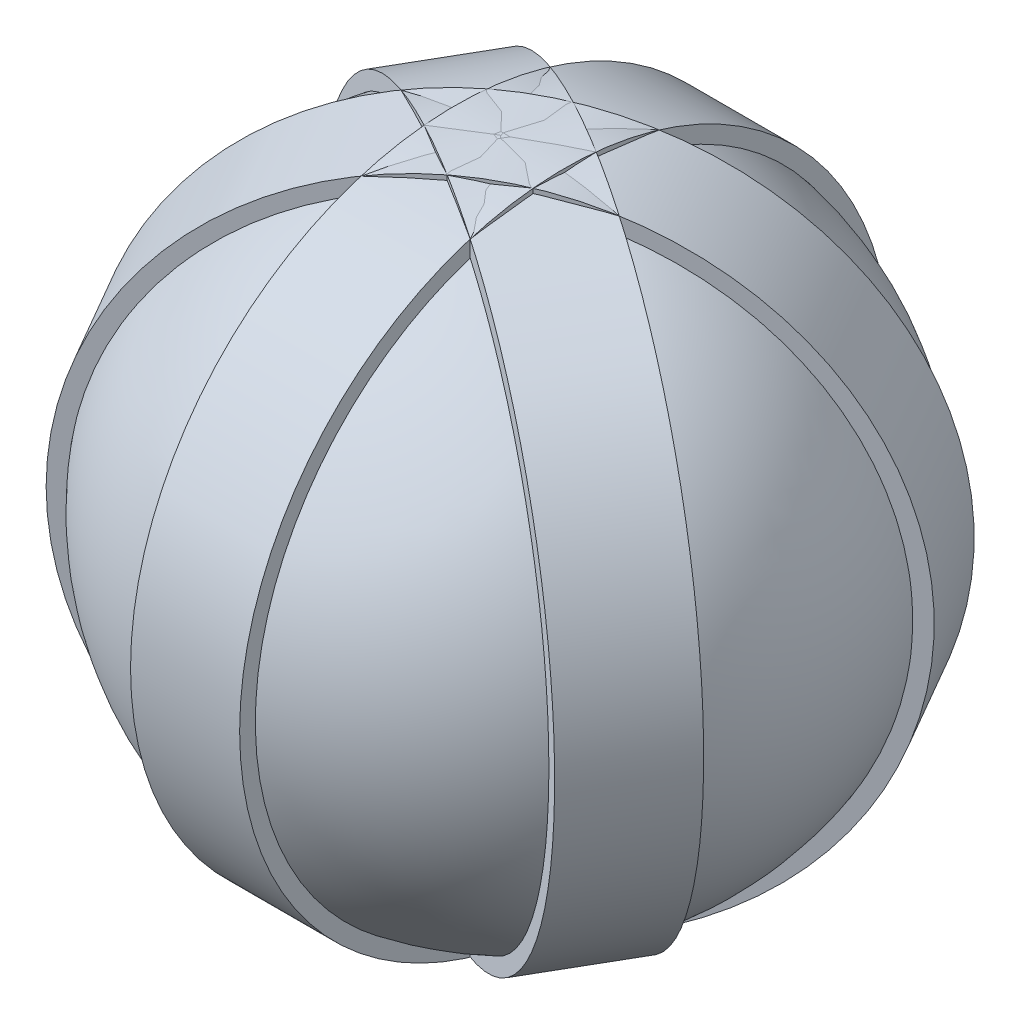
ISO-10303-21;
HEADER;
FILE_DESCRIPTION(('STEP AP214'),'2;1');
FILE_NAME('part.step','',(''),(''),'','','');
FILE_SCHEMA(('AUTOMOTIVE_DESIGN { 1 0 10303 214 1 1 1 1 }'));
ENDSEC;
DATA;
#1=APPLICATION_CONTEXT('core data for automotive mechanical design processes');
#2=APPLICATION_PROTOCOL_DEFINITION('international standard','automotive_design',2000,#1);
#3=PRODUCT_CONTEXT('',#1,'mechanical');
#4=PRODUCT('Part','Part','',(#3));
#5=PRODUCT_RELATED_PRODUCT_CATEGORY('part','',(#4));
#6=PRODUCT_DEFINITION_FORMATION('','',#4);
#7=PRODUCT_DEFINITION_CONTEXT('part definition',#1,'design');
#8=PRODUCT_DEFINITION('design','',#6,#7);
#9=PRODUCT_DEFINITION_SHAPE('','',#8);
#10=(LENGTH_UNIT() NAMED_UNIT(*) SI_UNIT(.MILLI.,.METRE.));
#11=(NAMED_UNIT(*) PLANE_ANGLE_UNIT() SI_UNIT($,.RADIAN.));
#12=(NAMED_UNIT(*) SI_UNIT($,.STERADIAN.) SOLID_ANGLE_UNIT());
#13=UNCERTAINTY_MEASURE_WITH_UNIT(LENGTH_MEASURE(1.E-05),#10,'distance_accuracy_value','');
#14=(GEOMETRIC_REPRESENTATION_CONTEXT(3) GLOBAL_UNCERTAINTY_ASSIGNED_CONTEXT((#13)) GLOBAL_UNIT_ASSIGNED_CONTEXT((#10,
#11,#12)) REPRESENTATION_CONTEXT('',''));
#15=CARTESIAN_POINT('',(0.,0.,0.));
#16=DIRECTION('',(0.,0.,1.));
#17=DIRECTION('',(1.,0.,0.));
#18=AXIS2_PLACEMENT_3D('',#15,#16,#17);
#19=CARTESIAN_POINT('',(20.0000000000001,0.,0.));
#20=DIRECTION('',(0.500000000000004,0.,-0.866025403784436));
#21=DIRECTION('',(0.,1.,0.));
#22=AXIS2_PLACEMENT_3D('',#19,#20,#21);
#23=SPHERICAL_SURFACE('',#22,20.);
#24=CARTESIAN_POINT('',(18.2635182233308,0.,3.00767466360865));
#25=DIRECTION('',(0.500000000000004,0.,-0.866025403784436));
#26=DIRECTION('',(-0.866025403784436,0.,-0.500000000000004));
#27=AXIS2_PLACEMENT_3D('',#24,#25,#26);
#28=CIRCLE('',#27,19.6961550602442);
#29=CARTESIAN_POINT('',(18.2635182233308,19.6961550602442,3.00767466360865));
#30=VERTEX_POINT('',#29);
#31=EDGE_CURVE('E54',#30,#30,#28,.T.);
#32=CARTESIAN_POINT('',(21.7364817766694,0.,-3.00767466360864));
#33=DIRECTION('',(0.500000000000004,0.,-0.866025403784436));
#34=DIRECTION('',(-0.866025403784436,0.,-0.500000000000004));
#35=AXIS2_PLACEMENT_3D('',#32,#33,#34);
#36=CIRCLE('',#35,19.6961550602442);
#37=CARTESIAN_POINT('',(21.7364817766693,19.6961550602442,-3.00767466360863));
#38=VERTEX_POINT('',#37);
#39=EDGE_CURVE('E11',#38,#38,#36,.T.);
#40=CARTESIAN_POINT('',(18.2635182233308,19.6961550602442,3.00767466360865));
#41=CARTESIAN_POINT('',(18.2993268423417,19.7087831288007,2.9456523161328));
#42=CARTESIAN_POINT('',(18.3351699017544,19.7210205530654,2.88357031613143));
#43=CARTESIAN_POINT('',(18.406920630354,19.7447127303297,2.75929440871671));
#44=CARTESIAN_POINT('',(18.4428282995411,19.7561674833292,2.69710050130335));
#45=CARTESIAN_POINT('',(18.5147039766607,19.7782929353812,2.57260817670371));
#46=CARTESIAN_POINT('',(18.5506719845933,19.7889636344337,2.51030975951741));
#47=CARTESIAN_POINT('',(18.6226640589355,19.8095197141586,2.38561582901454));
#48=CARTESIAN_POINT('',(18.658688125345,19.819405094831,2.32322031569796));
#49=CARTESIAN_POINT('',(18.7307880302541,19.8383893601214,2.19833961717458));
#50=CARTESIAN_POINT('',(18.7668638687536,19.8474882447393,2.13585443196779));
#51=CARTESIAN_POINT('',(18.8390630251473,19.8648984356229,2.01080182483028));
#52=CARTESIAN_POINT('',(18.8751863430415,19.8732097418886,1.94823440289958));
#53=CARTESIAN_POINT('',(18.9474761599194,19.8890437870041,1.82302476719727));
#54=CARTESIAN_POINT('',(18.983642658903,19.8965665258539,1.76038255342566));
#55=CARTESIAN_POINT('',(19.0560145345059,19.910822541034,1.63503078784244));
#56=CARTESIAN_POINT('',(19.0922199111251,19.9175558173643,1.57232123603082));
#57=CARTESIAN_POINT('',(19.1646652339219,19.9302321063056,1.44684225617607));
#58=CARTESIAN_POINT('',(19.2009051800995,19.9361751189165,1.38407282813295));
#59=CARTESIAN_POINT('',(19.2734153298216,19.9472701732621,1.2584815647497));
#60=CARTESIAN_POINT('',(19.3096855333662,19.9524222149967,1.19565972940957));
#61=CARTESIAN_POINT('',(19.382251882031,19.9619347145474,1.06997112660242));
#62=CARTESIAN_POINT('',(19.4185480271512,19.9662951723636,1.00710435913538));
#63=CARTESIAN_POINT('',(19.4911619400888,19.9742239852269,0.881333372591071));
#64=CARTESIAN_POINT('',(19.5274797079062,19.977792340274,0.818429153513792));
#65=CARTESIAN_POINT('',(19.6001325447872,19.9841365230004,0.692590748721993));
#66=CARTESIAN_POINT('',(19.6364676138507,19.9869123506797,0.629656563007473));
#67=CARTESIAN_POINT('',(19.7091507297139,19.9916711483749,0.503765713479931));
#68=CARTESIAN_POINT('',(19.7454987765137,19.9936541183908,0.440809049666908));
#69=CARTESIAN_POINT('',(19.8182035227953,19.9968269648055,0.314880735155771));
#70=CARTESIAN_POINT('',(19.8545602222771,19.9980168412044,0.251909084457657));
#71=CARTESIAN_POINT('',(19.9272779478394,19.9996033588016,0.125958289173031));
#72=CARTESIAN_POINT('',(19.9636389739197,20.,0.0629791445865202));
#73=CARTESIAN_POINT('',(20.0363610260804,20.,-0.0629791445865008));
#74=CARTESIAN_POINT('',(20.0727220521608,19.9996033588016,-0.125958289173011));
#75=CARTESIAN_POINT('',(20.145439777723,19.9980168412044,-0.251909084457636));
#76=CARTESIAN_POINT('',(20.1817964772049,19.9968269648055,-0.314880735155751));
#77=CARTESIAN_POINT('',(20.2545012234865,19.9936541183908,-0.440809049666888));
#78=CARTESIAN_POINT('',(20.2908492702862,19.9916711483749,-0.503765713479911));
#79=CARTESIAN_POINT('',(20.3635323861494,19.9869123506797,-0.629656563007453));
#80=CARTESIAN_POINT('',(20.3998674552129,19.9841365230004,-0.692590748721974));
#81=CARTESIAN_POINT('',(20.4725202920939,19.977792340274,-0.818429153513773));
#82=CARTESIAN_POINT('',(20.5088380599113,19.9742239852269,-0.881333372591052));
#83=CARTESIAN_POINT('',(20.5814519728489,19.9662951723636,-1.00710435913536));
#84=CARTESIAN_POINT('',(20.6177481179691,19.9619347145475,-1.0699711266024));
#85=CARTESIAN_POINT('',(20.6903144666339,19.9524222149967,-1.19565972940956));
#86=CARTESIAN_POINT('',(20.7265846701785,19.9472701732621,-1.25848156474968));
#87=CARTESIAN_POINT('',(20.7990948199007,19.9361751189166,-1.38407282813293));
#88=CARTESIAN_POINT('',(20.8353347660782,19.9302321063056,-1.44684225617605));
#89=CARTESIAN_POINT('',(20.907780088875,19.9175558173643,-1.5723212360308));
#90=CARTESIAN_POINT('',(20.9439854654942,19.910822541034,-1.63503078784242));
#91=CARTESIAN_POINT('',(21.0163573410971,19.8965665258539,-1.76038255342564));
#92=CARTESIAN_POINT('',(21.0525238400808,19.8890437870042,-1.82302476719725));
#93=CARTESIAN_POINT('',(21.1248136569586,19.8732097418887,-1.94823440289956));
#94=CARTESIAN_POINT('',(21.1609369748528,19.8648984356229,-2.01080182483026));
#95=CARTESIAN_POINT('',(21.2331361312465,19.8474882447393,-2.13585443196777));
#96=CARTESIAN_POINT('',(21.269211969746,19.8383893601214,-2.19833961717456));
#97=CARTESIAN_POINT('',(21.3413118746551,19.8194050948311,-2.32322031569794));
#98=CARTESIAN_POINT('',(21.3773359410647,19.8095197141586,-2.38561582901452));
#99=CARTESIAN_POINT('',(21.4493280154068,19.7889636344337,-2.5103097595174));
#100=CARTESIAN_POINT('',(21.4852960233394,19.7782929353812,-2.57260817670369));
#101=CARTESIAN_POINT('',(21.557171700459,19.7561674833292,-2.69710050130333));
#102=CARTESIAN_POINT('',(21.5930793696461,19.7447127303297,-2.75929440871669));
#103=CARTESIAN_POINT('',(21.6648300982458,19.7210205530655,-2.88357031613141));
#104=CARTESIAN_POINT('',(21.7006731576584,19.7087831288007,-2.94565231613278));
#105=CARTESIAN_POINT('',(21.7364817766693,19.6961550602442,-3.00767466360863));
#106=B_SPLINE_CURVE_WITH_KNOTS('',3,(#40,#41,#42,#43,#44,#45,#46,#47,#48,#49,#50,#51,#52,#53,
#54,#55,#56,#57,#58,#59,#60,#61,#62,#63,#64,#65,#66,#67,#68,#69,#70,#71,#72,#73,#74,#75,#76,#77,
#78,#79,#80,#81,#82,#83,#84,#85,#86,#87,#88,#89,#90,#91,#92,#93,#94,#95,#96,#97,#98,#99,#100,
#101,#102,#103,#104,#105),.UNSPECIFIED.,.F.,.F.,(4,2,2,2,2,2,2,2,2,2,2,2,2,2,2,2,2,2,2,2,2,2,2,
2,2,2,2,2,2,2,2,2,4),(0.,0.218165074840549,0.4363301496811,0.65449522452165,0.8726602993622,
1.09082537420275,1.3089904490433,1.52715552388385,1.7453205987244,1.96348567356495,
2.1816507484055,2.39981582324605,2.6179808980866,2.83614597292715,3.0543110477677,
3.27247612260825,3.4906411974488,3.70880627228935,3.9269713471299,4.14513642197045,
4.36330149681099,4.58146657165154,4.7996316464921,5.01779672133264,5.23596179617319,
5.45412687101375,5.67229194585429,5.89045702069484,6.1086220955354,6.32678717037594,
6.54495224521649,6.76311732005704,6.98128239489759),.UNSPECIFIED.);
#107=EDGE_CURVE('BSEAM40',#30,#38,#106,.T.);
#108=ORIENTED_EDGE('',*,*,#31,.F.);
#109=ORIENTED_EDGE('',*,*,#39,.T.);
#110=ORIENTED_EDGE('',*,*,#107,.T.);
#111=ORIENTED_EDGE('',*,*,#107,.F.);
#112=EDGE_LOOP('',(#108,#110,#109,#111));
#113=FACE_BOUND('',#112,.T.);
#114=ADVANCED_FACE('F40',(#113),#23,.F.);
#115=CARTESIAN_POINT('',(21.7364817766694,19.6961550602442,-3.00767466360864));
#116=DIRECTION('',(-0.500000000000004,0.,0.866025403784436));
#117=DIRECTION('',(0.866025403784436,0.,0.500000000000004));
#118=AXIS2_PLACEMENT_3D('',#115,#116,#117);
#119=PLANE('',#118);
#120=ORIENTED_EDGE('',*,*,#39,.F.);
#121=EDGE_LOOP('',(#120));
#122=FACE_BOUND('',#121,.T.);
#123=CARTESIAN_POINT('',(21.7364817766694,0.,-3.00767466360864));
#124=DIRECTION('',(0.500000000000004,0.,-0.866025403784436));
#125=DIRECTION('',(-0.866025403784436,0.,-0.500000000000004));
#126=AXIS2_PLACEMENT_3D('',#123,#124,#125);
#127=CIRCLE('',#126,20.6961550602442);
#128=CARTESIAN_POINT('',(3.81308573383607,0.,-13.3557521937308));
#129=VERTEX_POINT('',#128);
#130=EDGE_CURVE('E46',#129,#129,#127,.T.);
#131=ORIENTED_EDGE('',*,*,#130,.T.);
#132=EDGE_LOOP('',(#131));
#133=FACE_BOUND('',#132,.T.);
#134=ADVANCED_FACE('F63',(#122,#133),#119,.F.);
#135=CARTESIAN_POINT('',(30.0000000000002,0.,-17.3205080756888));
#136=DIRECTION('',(0.500000000000004,0.,-0.866025403784436));
#137=DIRECTION('',(-0.866025403784436,0.,-0.500000000000004));
#138=AXIS2_PLACEMENT_3D('',#135,#136,#137);
#139=CYLINDRICAL_SURFACE('',#138,20.6961550602442);
#140=ORIENTED_EDGE('',*,*,#130,.F.);
#141=EDGE_LOOP('',(#140));
#142=FACE_BOUND('',#141,.T.);
#143=CARTESIAN_POINT('',(18.2635182233308,0.,3.00767466360865));
#144=DIRECTION('',(0.500000000000004,0.,-0.866025403784436));
#145=DIRECTION('',(-0.866025403784436,0.,-0.500000000000004));
#146=AXIS2_PLACEMENT_3D('',#143,#144,#145);
#147=CIRCLE('',#146,20.6961550602442);
#148=CARTESIAN_POINT('',(0.340122180497497,0.,-7.34040286651353));
#149=VERTEX_POINT('',#148);
#150=EDGE_CURVE('E50',#149,#149,#147,.T.);
#151=ORIENTED_EDGE('',*,*,#150,.T.);
#152=EDGE_LOOP('',(#151));
#153=FACE_BOUND('',#152,.T.);
#154=ADVANCED_FACE('F67',(#142,#153),#139,.T.);
#155=CARTESIAN_POINT('',(18.2635182233308,20.6961550602442,3.00767466360865));
#156=DIRECTION('',(0.500000000000004,0.,-0.866025403784436));
#157=DIRECTION('',(-0.866025403784436,0.,-0.500000000000004));
#158=AXIS2_PLACEMENT_3D('',#155,#156,#157);
#159=PLANE('',#158);
#160=ORIENTED_EDGE('',*,*,#150,.F.);
#161=EDGE_LOOP('',(#160));
#162=FACE_BOUND('',#161,.T.);
#163=ORIENTED_EDGE('',*,*,#31,.T.);
#164=EDGE_LOOP('',(#163));
#165=FACE_BOUND('',#164,.T.);
#166=ADVANCED_FACE('F60',(#162,#165),#159,.F.);
#167=CLOSED_SHELL('',(#114,#134,#154,#166));
#168=MANIFOLD_SOLID_BREP('B2',#167);
#169=CARTESIAN_POINT('',(20.,0.,0.));
#170=DIRECTION('',(-0.499999999999998,0.,-0.86602540378444));
#171=DIRECTION('',(0.,1.,0.));
#172=AXIS2_PLACEMENT_3D('',#169,#170,#171);
#173=SPHERICAL_SURFACE('',#172,20.);
#174=CARTESIAN_POINT('',(21.7364817766693,0.,3.00767466360866));
#175=DIRECTION('',(-0.499999999999998,0.,-0.86602540378444));
#176=DIRECTION('',(-0.86602540378444,0.,0.499999999999998));
#177=AXIS2_PLACEMENT_3D('',#174,#175,#176);
#178=CIRCLE('',#177,19.6961550602442);
#179=CARTESIAN_POINT('',(21.7364817766693,19.6961550602442,3.00767466360867));
#180=VERTEX_POINT('',#179);
#181=EDGE_CURVE('E124',#180,#180,#178,.T.);
#182=CARTESIAN_POINT('',(18.2635182233308,0.,-3.00767466360865));
#183=DIRECTION('',(-0.499999999999998,0.,-0.86602540378444));
#184=DIRECTION('',(-0.86602540378444,0.,0.499999999999998));
#185=AXIS2_PLACEMENT_3D('',#182,#183,#184);
#186=CIRCLE('',#185,19.6961550602442);
#187=CARTESIAN_POINT('',(18.2635182233308,19.6961550602442,-3.00767466360864));
#188=VERTEX_POINT('',#187);
#189=EDGE_CURVE('E39',#188,#188,#186,.T.);
#190=CARTESIAN_POINT('',(21.7364817766693,19.6961550602442,3.00767466360867));
#191=CARTESIAN_POINT('',(21.7006731576584,19.7087831288007,2.94565231613282));
#192=CARTESIAN_POINT('',(21.6648300982458,19.7210205530654,2.88357031613145));
#193=CARTESIAN_POINT('',(21.5930793696461,19.7447127303297,2.75929440871672));
#194=CARTESIAN_POINT('',(21.557171700459,19.7561674833292,2.69710050130336));
#195=CARTESIAN_POINT('',(21.4852960233394,19.7782929353812,2.57260817670372));
#196=CARTESIAN_POINT('',(21.4493280154068,19.7889636344337,2.51030975951743));
#197=CARTESIAN_POINT('',(21.3773359410646,19.8095197141586,2.38561582901455));
#198=CARTESIAN_POINT('',(21.3413118746551,19.819405094831,2.32322031569797));
#199=CARTESIAN_POINT('',(21.269211969746,19.8383893601214,2.19833961717459));
#200=CARTESIAN_POINT('',(21.2331361312465,19.8474882447393,2.1358544319678));
#201=CARTESIAN_POINT('',(21.1609369748528,19.8648984356229,2.01080182483029));
#202=CARTESIAN_POINT('',(21.1248136569586,19.8732097418886,1.94823440289959));
#203=CARTESIAN_POINT('',(21.0525238400808,19.8890437870041,1.82302476719727));
#204=CARTESIAN_POINT('',(21.0163573410971,19.8965665258539,1.76038255342567));
#205=CARTESIAN_POINT('',(20.9439854654942,19.910822541034,1.63503078784244));
#206=CARTESIAN_POINT('',(20.907780088875,19.9175558173643,1.57232123603082));
#207=CARTESIAN_POINT('',(20.8353347660782,19.9302321063056,1.44684225617608));
#208=CARTESIAN_POINT('',(20.7990948199007,19.9361751189165,1.38407282813296));
#209=CARTESIAN_POINT('',(20.7265846701785,19.9472701732621,1.25848156474971));
#210=CARTESIAN_POINT('',(20.6903144666339,19.9524222149967,1.19565972940958));
#211=CARTESIAN_POINT('',(20.6177481179691,19.9619347145474,1.06997112660242));
#212=CARTESIAN_POINT('',(20.5814519728489,19.9662951723636,1.00710435913539));
#213=CARTESIAN_POINT('',(20.5088380599113,19.9742239852269,0.881333372591076));
#214=CARTESIAN_POINT('',(20.4725202920939,19.977792340274,0.818429153513797));
#215=CARTESIAN_POINT('',(20.3998674552129,19.9841365230004,0.692590748721998));
#216=CARTESIAN_POINT('',(20.3635323861494,19.9869123506797,0.629656563007477));
#217=CARTESIAN_POINT('',(20.2908492702862,19.9916711483749,0.503765713479934));
#218=CARTESIAN_POINT('',(20.2545012234865,19.9936541183908,0.440809049666911));
#219=CARTESIAN_POINT('',(20.1817964772049,19.9968269648055,0.314880735155774));
#220=CARTESIAN_POINT('',(20.145439777723,19.9980168412044,0.251909084457659));
#221=CARTESIAN_POINT('',(20.0727220521608,19.9996033588016,0.125958289173033));
#222=CARTESIAN_POINT('',(20.0363610260804,20.,0.0629791445865222));
#223=CARTESIAN_POINT('',(19.9636389739197,20.,-0.0629791445864993));
#224=CARTESIAN_POINT('',(19.9272779478394,19.9996033588016,-0.12595828917301));
#225=CARTESIAN_POINT('',(19.8545602222771,19.9980168412044,-0.251909084457636));
#226=CARTESIAN_POINT('',(19.8182035227953,19.9968269648055,-0.314880735155751));
#227=CARTESIAN_POINT('',(19.7454987765137,19.9936541183908,-0.440809049666889));
#228=CARTESIAN_POINT('',(19.7091507297139,19.9916711483749,-0.503765713479911));
#229=CARTESIAN_POINT('',(19.6364676138507,19.9869123506797,-0.629656563007454));
#230=CARTESIAN_POINT('',(19.6001325447872,19.9841365230004,-0.692590748721975));
#231=CARTESIAN_POINT('',(19.5274797079062,19.977792340274,-0.818429153513775));
#232=CARTESIAN_POINT('',(19.4911619400888,19.9742239852269,-0.881333372591054));
#233=CARTESIAN_POINT('',(19.4185480271512,19.9662951723636,-1.00710435913537));
#234=CARTESIAN_POINT('',(19.382251882031,19.9619347145475,-1.0699711266024));
#235=CARTESIAN_POINT('',(19.3096855333663,19.9524222149967,-1.19565972940956));
#236=CARTESIAN_POINT('',(19.2734153298217,19.9472701732621,-1.25848156474968));
#237=CARTESIAN_POINT('',(19.2009051800995,19.9361751189166,-1.38407282813293));
#238=CARTESIAN_POINT('',(19.1646652339219,19.9302321063056,-1.44684225617606));
#239=CARTESIAN_POINT('',(19.0922199111251,19.9175558173643,-1.5723212360308));
#240=CARTESIAN_POINT('',(19.0560145345059,19.910822541034,-1.63503078784242));
#241=CARTESIAN_POINT('',(18.983642658903,19.8965665258539,-1.76038255342565));
#242=CARTESIAN_POINT('',(18.9474761599194,19.8890437870042,-1.82302476719725));
#243=CARTESIAN_POINT('',(18.8751863430415,19.8732097418887,-1.94823440289956));
#244=CARTESIAN_POINT('',(18.8390630251473,19.8648984356229,-2.01080182483027));
#245=CARTESIAN_POINT('',(18.7668638687536,19.8474882447393,-2.13585443196777));
#246=CARTESIAN_POINT('',(18.7307880302541,19.8383893601214,-2.19833961717457));
#247=CARTESIAN_POINT('',(18.658688125345,19.8194050948311,-2.32322031569795));
#248=CARTESIAN_POINT('',(18.6226640589355,19.8095197141586,-2.38561582901453));
#249=CARTESIAN_POINT('',(18.5506719845934,19.7889636344337,-2.5103097595174));
#250=CARTESIAN_POINT('',(18.5147039766608,19.7782929353812,-2.5726081767037));
#251=CARTESIAN_POINT('',(18.4428282995411,19.7561674833292,-2.69710050130334));
#252=CARTESIAN_POINT('',(18.4069206303541,19.7447127303297,-2.7592944087167));
#253=CARTESIAN_POINT('',(18.3351699017544,19.7210205530655,-2.88357031613142));
#254=CARTESIAN_POINT('',(18.2993268423418,19.7087831288007,-2.94565231613279));
#255=CARTESIAN_POINT('',(18.2635182233308,19.6961550602442,-3.00767466360864));
#256=B_SPLINE_CURVE_WITH_KNOTS('',3,(#190,#191,#192,#193,#194,#195,#196,#197,#198,#199,#200,
#201,#202,#203,#204,#205,#206,#207,#208,#209,#210,#211,#212,#213,#214,#215,#216,#217,#218,#219,
#220,#221,#222,#223,#224,#225,#226,#227,#228,#229,#230,#231,#232,#233,#234,#235,#236,#237,#238,
#239,#240,#241,#242,#243,#244,#245,#246,#247,#248,#249,#250,#251,#252,#253,#254,#255),
.UNSPECIFIED.,.F.,.F.,(4,2,2,2,2,2,2,2,2,2,2,2,2,2,2,2,2,2,2,2,2,2,2,2,2,2,2,2,2,2,2,2,4),(0.,
0.21816507484055,0.436330149681099,0.65449522452165,0.872660299362199,1.09082537420275,
1.3089904490433,1.52715552388385,1.7453205987244,1.96348567356495,2.1816507484055,
2.39981582324605,2.6179808980866,2.83614597292715,3.0543110477677,3.27247612260825,
3.4906411974488,3.70880627228935,3.92697134712989,4.14513642197045,4.36330149681099,
4.58146657165154,4.79963164649209,5.01779672133264,5.23596179617319,5.45412687101374,
5.67229194585429,5.89045702069484,6.10862209553539,6.32678717037594,6.54495224521649,
6.76311732005704,6.98128239489759),.UNSPECIFIED.);
#257=EDGE_CURVE('BSEAM110',#180,#188,#256,.T.);
#258=ORIENTED_EDGE('',*,*,#181,.F.);
#259=ORIENTED_EDGE('',*,*,#189,.T.);
#260=ORIENTED_EDGE('',*,*,#257,.T.);
#261=ORIENTED_EDGE('',*,*,#257,.F.);
#262=EDGE_LOOP('',(#258,#260,#259,#261));
#263=FACE_BOUND('',#262,.T.);
#264=ADVANCED_FACE('F110',(#263),#173,.F.);
#265=CARTESIAN_POINT('',(18.2635182233308,19.6961550602442,-3.00767466360865));
#266=DIRECTION('',(0.499999999999998,0.,0.86602540378444));
#267=DIRECTION('',(0.86602540378444,0.,-0.499999999999998));
#268=AXIS2_PLACEMENT_3D('',#265,#266,#267);
#269=PLANE('',#268);
#270=ORIENTED_EDGE('',*,*,#189,.F.);
#271=EDGE_LOOP('',(#270));
#272=FACE_BOUND('',#271,.T.);
#273=CARTESIAN_POINT('',(18.2635182233308,0.,-3.00767466360865));
#274=DIRECTION('',(-0.499999999999998,0.,-0.86602540378444));
#275=DIRECTION('',(-0.86602540378444,0.,0.499999999999998));
#276=AXIS2_PLACEMENT_3D('',#273,#274,#275);
#277=CIRCLE('',#276,20.6961550602442);
#278=CARTESIAN_POINT('',(0.340122180497452,0.,7.3404028665134));
#279=VERTEX_POINT('',#278);
#280=EDGE_CURVE('E116',#279,#279,#277,.T.);
#281=ORIENTED_EDGE('',*,*,#280,.T.);
#282=EDGE_LOOP('',(#281));
#283=FACE_BOUND('',#282,.T.);
#284=ADVANCED_FACE('F133',(#272,#283),#269,.F.);
#285=CARTESIAN_POINT('',(10.0000000000001,0.,-17.3205080756888));
#286=DIRECTION('',(-0.499999999999998,0.,-0.86602540378444));
#287=DIRECTION('',(-0.86602540378444,0.,0.499999999999998));
#288=AXIS2_PLACEMENT_3D('',#285,#286,#287);
#289=CYLINDRICAL_SURFACE('',#288,20.6961550602442);
#290=ORIENTED_EDGE('',*,*,#280,.F.);
#291=EDGE_LOOP('',(#290));
#292=FACE_BOUND('',#291,.T.);
#293=CARTESIAN_POINT('',(21.7364817766693,0.,3.00767466360866));
#294=DIRECTION('',(-0.499999999999998,0.,-0.86602540378444));
#295=DIRECTION('',(-0.86602540378444,0.,0.499999999999998));
#296=AXIS2_PLACEMENT_3D('',#293,#294,#295);
#297=CIRCLE('',#296,20.6961550602442);
#298=CARTESIAN_POINT('',(3.81308573383599,0.,13.3557521937307));
#299=VERTEX_POINT('',#298);
#300=EDGE_CURVE('E120',#299,#299,#297,.T.);
#301=ORIENTED_EDGE('',*,*,#300,.T.);
#302=EDGE_LOOP('',(#301));
#303=FACE_BOUND('',#302,.T.);
#304=ADVANCED_FACE('F137',(#292,#303),#289,.T.);
#305=CARTESIAN_POINT('',(21.7364817766693,20.6961550602442,3.00767466360866));
#306=DIRECTION('',(-0.499999999999998,0.,-0.86602540378444));
#307=DIRECTION('',(-0.86602540378444,0.,0.499999999999998));
#308=AXIS2_PLACEMENT_3D('',#305,#306,#307);
#309=PLANE('',#308);
#310=ORIENTED_EDGE('',*,*,#300,.F.);
#311=EDGE_LOOP('',(#310));
#312=FACE_BOUND('',#311,.T.);
#313=ORIENTED_EDGE('',*,*,#181,.T.);
#314=EDGE_LOOP('',(#313));
#315=FACE_BOUND('',#314,.T.);
#316=ADVANCED_FACE('F130',(#312,#315),#309,.F.);
#317=CLOSED_SHELL('',(#264,#284,#304,#316));
#318=MANIFOLD_SOLID_BREP('B6',#317);
#319=CARTESIAN_POINT('',(20.,0.,0.));
#320=DIRECTION('',(-1.,0.,0.));
#321=DIRECTION('',(0.,1.,0.));
#322=AXIS2_PLACEMENT_3D('',#319,#320,#321);
#323=SPHERICAL_SURFACE('',#322,20.);
#324=CARTESIAN_POINT('',(23.4729635533386,0.,0.));
#325=DIRECTION('',(-1.,0.,0.));
#326=DIRECTION('',(0.,0.,1.));
#327=AXIS2_PLACEMENT_3D('',#324,#325,#326);
#328=CIRCLE('',#327,19.6961550602442);
#329=CARTESIAN_POINT('',(23.4729635533386,19.6961550602442,0.));
#330=VERTEX_POINT('',#329);
#331=EDGE_CURVE('E191',#330,#330,#328,.T.);
#332=CARTESIAN_POINT('',(16.5270364466615,0.,0.));
#333=DIRECTION('',(-1.,0.,0.));
#334=DIRECTION('',(0.,0.,1.));
#335=AXIS2_PLACEMENT_3D('',#332,#333,#334);
#336=CIRCLE('',#335,19.6961550602442);
#337=CARTESIAN_POINT('',(16.5270364466615,19.6961550602442,0.));
#338=VERTEX_POINT('',#337);
#339=EDGE_CURVE('E109',#338,#338,#336,.T.);
#340=CARTESIAN_POINT('',(23.4729635533386,19.6961550602442,0.));
#341=CARTESIAN_POINT('',(23.4013463153167,19.7087831288007,0.));
#342=CARTESIAN_POINT('',(23.3296601964915,19.7210205530654,0.));
#343=CARTESIAN_POINT('',(23.1861587392921,19.7447127303297,0.));
#344=CARTESIAN_POINT('',(23.114343400918,19.7561674833292,0.));
#345=CARTESIAN_POINT('',(22.9705920466787,19.7782929353812,0.));
#346=CARTESIAN_POINT('',(22.8986560308135,19.7889636344337,0.));
#347=CARTESIAN_POINT('',(22.7546718821292,19.8095197141586,0.));
#348=CARTESIAN_POINT('',(22.6826237493101,19.819405094831,0.));
#349=CARTESIAN_POINT('',(22.538423939492,19.8383893601214,0.));
#350=CARTESIAN_POINT('',(22.466272262493,19.8474882447393,0.));
#351=CARTESIAN_POINT('',(22.3218739497056,19.8648984356229,0.));
#352=CARTESIAN_POINT('',(22.2496273139172,19.8732097418886,0.));
#353=CARTESIAN_POINT('',(22.1050476801615,19.8890437870041,0.));
#354=CARTESIAN_POINT('',(22.0327146821941,19.8965665258539,0.));
#355=CARTESIAN_POINT('',(21.8879709309884,19.910822541034,0.));
#356=CARTESIAN_POINT('',(21.81556017775,19.9175558173643,0.));
#357=CARTESIAN_POINT('',(21.6706695321564,19.9302321063056,0.));
#358=CARTESIAN_POINT('',(21.5981896398013,19.9361751189165,0.));
#359=CARTESIAN_POINT('',(21.4531693403569,19.9472701732621,0.));
#360=CARTESIAN_POINT('',(21.3806289332677,19.9524222149967,0.));
#361=CARTESIAN_POINT('',(21.2354962359381,19.9619347145474,0.));
#362=CARTESIAN_POINT('',(21.1629039456978,19.9662951723636,0.));
#363=CARTESIAN_POINT('',(21.0176761198226,19.9742239852269,0.));
#364=CARTESIAN_POINT('',(20.9450405841877,19.977792340274,0.));
#365=CARTESIAN_POINT('',(20.7997349104258,19.9841365230004,0.));
#366=CARTESIAN_POINT('',(20.7270647722988,19.9869123506797,0.));
#367=CARTESIAN_POINT('',(20.5816985405723,19.9916711483749,0.));
#368=CARTESIAN_POINT('',(20.5090024469729,19.9936541183908,0.));
#369=CARTESIAN_POINT('',(20.3635929544097,19.9968269648055,0.));
#370=CARTESIAN_POINT('',(20.2908795554459,19.9980168412044,0.));
#371=CARTESIAN_POINT('',(20.1454441043215,19.9996033588016,0.));
#372=CARTESIAN_POINT('',(20.0727220521608,20.,0.));
#373=CARTESIAN_POINT('',(19.9272779478394,20.,0.));
#374=CARTESIAN_POINT('',(19.8545558956787,19.9996033588016,0.));
#375=CARTESIAN_POINT('',(19.7091204445542,19.9980168412044,0.));
#376=CARTESIAN_POINT('',(19.6364070455905,19.9968269648055,0.));
#377=CARTESIAN_POINT('',(19.4909975530273,19.9936541183908,0.));
#378=CARTESIAN_POINT('',(19.4183014594278,19.9916711483749,0.));
#379=CARTESIAN_POINT('',(19.2729352277013,19.9869123506797,0.));
#380=CARTESIAN_POINT('',(19.2002650895743,19.9841365230004,0.));
#381=CARTESIAN_POINT('',(19.0549594158124,19.977792340274,0.));
#382=CARTESIAN_POINT('',(18.9823238801776,19.9742239852269,0.));
#383=CARTESIAN_POINT('',(18.8370960543024,19.9662951723636,0.));
#384=CARTESIAN_POINT('',(18.764503764062,19.9619347145475,0.));
#385=CARTESIAN_POINT('',(18.6193710667325,19.9524222149967,0.));
#386=CARTESIAN_POINT('',(18.5468306596432,19.9472701732621,0.));
#387=CARTESIAN_POINT('',(18.4018103601989,19.9361751189166,0.));
#388=CARTESIAN_POINT('',(18.3293304678437,19.9302321063056,0.));
#389=CARTESIAN_POINT('',(18.1844398222502,19.9175558173643,0.));
#390=CARTESIAN_POINT('',(18.1120290690118,19.910822541034,0.));
#391=CARTESIAN_POINT('',(17.967285317806,19.8965665258539,0.));
#392=CARTESIAN_POINT('',(17.8949523198387,19.8890437870042,0.));
#393=CARTESIAN_POINT('',(17.750372686083,19.8732097418887,0.));
#394=CARTESIAN_POINT('',(17.6781260502946,19.8648984356229,0.));
#395=CARTESIAN_POINT('',(17.5337277375072,19.8474882447393,0.));
#396=CARTESIAN_POINT('',(17.4615760605081,19.8383893601214,0.));
#397=CARTESIAN_POINT('',(17.31737625069,19.8194050948311,0.));
#398=CARTESIAN_POINT('',(17.2453281178709,19.8095197141586,0.));
#399=CARTESIAN_POINT('',(17.1013439691866,19.7889636344337,0.));
#400=CARTESIAN_POINT('',(17.0294079533214,19.7782929353812,0.));
#401=CARTESIAN_POINT('',(16.8856565990821,19.7561674833292,0.));
#402=CARTESIAN_POINT('',(16.813841260708,19.7447127303297,0.));
#403=CARTESIAN_POINT('',(16.6703398035087,19.7210205530655,0.));
#404=CARTESIAN_POINT('',(16.5986536846834,19.7087831288007,0.));
#405=CARTESIAN_POINT('',(16.5270364466615,19.6961550602442,0.));
#406=B_SPLINE_CURVE_WITH_KNOTS('',3,(#340,#341,#342,#343,#344,#345,#346,#347,#348,#349,#350,
#351,#352,#353,#354,#355,#356,#357,#358,#359,#360,#361,#362,#363,#364,#365,#366,#367,#368,#369,
#370,#371,#372,#373,#374,#375,#376,#377,#378,#379,#380,#381,#382,#383,#384,#385,#386,#387,#388,
#389,#390,#391,#392,#393,#394,#395,#396,#397,#398,#399,#400,#401,#402,#403,#404,#405),
.UNSPECIFIED.,.F.,.F.,(4,2,2,2,2,2,2,2,2,2,2,2,2,2,2,2,2,2,2,2,2,2,2,2,2,2,2,2,2,2,2,2,4),(0.,
0.218165074840548,0.436330149681097,0.654495224521647,0.872660299362197,1.09082537420275,
1.3089904490433,1.52715552388385,1.7453205987244,1.96348567356495,2.18165074840549,
2.39981582324605,2.61798089808659,2.83614597292715,3.0543110477677,3.27247612260824,
3.49064119744879,3.70880627228934,3.92697134712989,4.14513642197044,4.36330149681099,
4.58146657165154,4.79963164649209,5.01779672133264,5.23596179617319,5.45412687101374,
5.67229194585429,5.89045702069484,6.10862209553539,6.32678717037594,6.54495224521649,
6.76311732005704,6.98128239489759),.UNSPECIFIED.);
#407=EDGE_CURVE('BSEAM177',#330,#338,#406,.T.);
#408=ORIENTED_EDGE('',*,*,#331,.F.);
#409=ORIENTED_EDGE('',*,*,#339,.T.);
#410=ORIENTED_EDGE('',*,*,#407,.T.);
#411=ORIENTED_EDGE('',*,*,#407,.F.);
#412=EDGE_LOOP('',(#408,#410,#409,#411));
#413=FACE_BOUND('',#412,.T.);
#414=ADVANCED_FACE('F177',(#413),#323,.F.);
#415=CARTESIAN_POINT('',(16.5270364466615,19.6961550602442,0.));
#416=DIRECTION('',(1.,0.,0.));
#417=DIRECTION('',(0.,0.,-1.));
#418=AXIS2_PLACEMENT_3D('',#415,#416,#417);
#419=PLANE('',#418);
#420=ORIENTED_EDGE('',*,*,#339,.F.);
#421=EDGE_LOOP('',(#420));
#422=FACE_BOUND('',#421,.T.);
#423=CARTESIAN_POINT('',(16.5270364466615,0.,0.));
#424=DIRECTION('',(-1.,0.,0.));
#425=DIRECTION('',(0.,0.,1.));
#426=AXIS2_PLACEMENT_3D('',#423,#424,#425);
#427=CIRCLE('',#426,20.6961550602442);
#428=CARTESIAN_POINT('',(16.5270364466615,0.,20.6961550602442));
#429=VERTEX_POINT('',#428);
#430=EDGE_CURVE('E183',#429,#429,#427,.T.);
#431=ORIENTED_EDGE('',*,*,#430,.T.);
#432=EDGE_LOOP('',(#431));
#433=FACE_BOUND('',#432,.T.);
#434=ADVANCED_FACE('F200',(#422,#433),#419,.F.);
#435=CARTESIAN_POINT('',(0.,0.,0.));
#436=DIRECTION('',(-1.,0.,0.));
#437=DIRECTION('',(0.,0.,1.));
#438=AXIS2_PLACEMENT_3D('',#435,#436,#437);
#439=CYLINDRICAL_SURFACE('',#438,20.6961550602442);
#440=ORIENTED_EDGE('',*,*,#430,.F.);
#441=EDGE_LOOP('',(#440));
#442=FACE_BOUND('',#441,.T.);
#443=CARTESIAN_POINT('',(23.4729635533386,0.,0.));
#444=DIRECTION('',(-1.,0.,0.));
#445=DIRECTION('',(0.,0.,1.));
#446=AXIS2_PLACEMENT_3D('',#443,#444,#445);
#447=CIRCLE('',#446,20.6961550602442);
#448=CARTESIAN_POINT('',(23.4729635533386,0.,20.6961550602442));
#449=VERTEX_POINT('',#448);
#450=EDGE_CURVE('E187',#449,#449,#447,.T.);
#451=ORIENTED_EDGE('',*,*,#450,.T.);
#452=EDGE_LOOP('',(#451));
#453=FACE_BOUND('',#452,.T.);
#454=ADVANCED_FACE('F204',(#442,#453),#439,.T.);
#455=CARTESIAN_POINT('',(23.4729635533386,20.6961550602442,0.));
#456=DIRECTION('',(-1.,0.,0.));
#457=DIRECTION('',(0.,0.,1.));
#458=AXIS2_PLACEMENT_3D('',#455,#456,#457);
#459=PLANE('',#458);
#460=ORIENTED_EDGE('',*,*,#450,.F.);
#461=EDGE_LOOP('',(#460));
#462=FACE_BOUND('',#461,.T.);
#463=ORIENTED_EDGE('',*,*,#331,.T.);
#464=EDGE_LOOP('',(#463));
#465=FACE_BOUND('',#464,.T.);
#466=ADVANCED_FACE('F197',(#462,#465),#459,.F.);
#467=CLOSED_SHELL('',(#414,#434,#454,#466));
#468=MANIFOLD_SOLID_BREP('B34',#467);
#469=CARTESIAN_POINT('',(20.,0.,0.));
#470=DIRECTION('',(-1.,0.,0.));
#471=DIRECTION('',(0.,1.,0.));
#472=AXIS2_PLACEMENT_3D('',#469,#470,#471);
#473=SPHERICAL_SURFACE('',#472,20.);
#474=CARTESIAN_POINT('',(0.,0.,0.));
#475=VERTEX_POINT('',#474);
#476=VERTEX_LOOP('',#475);
#477=FACE_BOUND('',#476,.T.);
#478=ADVANCED_FACE('F239',(#477),#473,.T.);
#479=CLOSED_SHELL('',(#478));
#480=MANIFOLD_SOLID_BREP('B104',#479);
#481=ADVANCED_BREP_SHAPE_REPRESENTATION('',(#18,#168,#318,#468,#480),#14);
#482=SHAPE_DEFINITION_REPRESENTATION(#9,#481);
ENDSEC;
END-ISO-10303-21;
